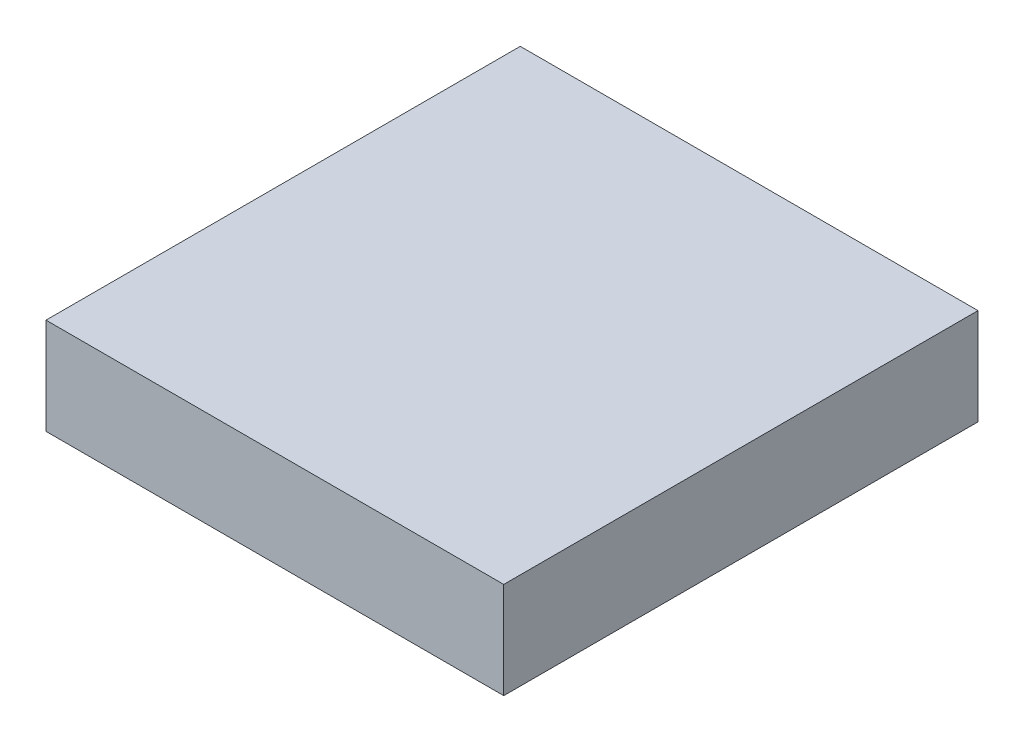
ISO-10303-21;
HEADER;
FILE_DESCRIPTION(('STEP AP214'),'2;1');
FILE_NAME('part.step','',(''),(''),'','','');
FILE_SCHEMA(('AUTOMOTIVE_DESIGN { 1 0 10303 214 1 1 1 1 }'));
ENDSEC;
DATA;
#1=APPLICATION_CONTEXT('core data for automotive mechanical design processes');
#2=APPLICATION_PROTOCOL_DEFINITION('international standard','automotive_design',2000,#1);
#3=PRODUCT_CONTEXT('',#1,'mechanical');
#4=PRODUCT('Part','Part','',(#3));
#5=PRODUCT_RELATED_PRODUCT_CATEGORY('part','',(#4));
#6=PRODUCT_DEFINITION_FORMATION('','',#4);
#7=PRODUCT_DEFINITION_CONTEXT('part definition',#1,'design');
#8=PRODUCT_DEFINITION('design','',#6,#7);
#9=PRODUCT_DEFINITION_SHAPE('','',#8);
#10=(LENGTH_UNIT() NAMED_UNIT(*) SI_UNIT(.MILLI.,.METRE.));
#11=(NAMED_UNIT(*) PLANE_ANGLE_UNIT() SI_UNIT($,.RADIAN.));
#12=(NAMED_UNIT(*) SI_UNIT($,.STERADIAN.) SOLID_ANGLE_UNIT());
#13=UNCERTAINTY_MEASURE_WITH_UNIT(LENGTH_MEASURE(1.E-05),#10,'distance_accuracy_value','');
#14=(GEOMETRIC_REPRESENTATION_CONTEXT(3) GLOBAL_UNCERTAINTY_ASSIGNED_CONTEXT((#13)) GLOBAL_UNIT_ASSIGNED_CONTEXT((#10,
#11,#12)) REPRESENTATION_CONTEXT('',''));
#15=CARTESIAN_POINT('',(0.,0.,0.));
#16=DIRECTION('',(0.,0.,1.));
#17=DIRECTION('',(1.,0.,0.));
#18=AXIS2_PLACEMENT_3D('',#15,#16,#17);
#19=CARTESIAN_POINT('',(-0.4826,-0.1016,1.));
#20=DIRECTION('',(1.,0.,0.));
#21=DIRECTION('',(0.,0.,-1.));
#22=AXIS2_PLACEMENT_3D('',#19,#20,#21);
#23=PLANE('',#22);
#24=DIRECTION('',(0.,-1.,0.));
#25=VECTOR('',#24,1.);
#26=CARTESIAN_POINT('',(-0.4826,-0.1016,0.));
#27=LINE('',#26,#25);
#28=CARTESIAN_POINT('',(-0.4826,0.1016,0.));
#29=VERTEX_POINT('',#28);
#30=CARTESIAN_POINT('',(-0.4826,-0.1016,0.));
#31=VERTEX_POINT('',#30);
#32=EDGE_CURVE('E95',#29,#31,#27,.T.);
#33=ORIENTED_EDGE('',*,*,#32,.T.);
#34=DIRECTION('',(0.,0.,-1.));
#35=VECTOR('',#34,1.);
#36=CARTESIAN_POINT('',(-0.4826,-0.1016,1.));
#37=LINE('',#36,#35);
#38=CARTESIAN_POINT('',(-0.4826,-0.1016,1.));
#39=VERTEX_POINT('',#38);
#40=EDGE_CURVE('E11',#39,#31,#37,.T.);
#41=ORIENTED_EDGE('',*,*,#40,.F.);
#42=DIRECTION('',(0.,-1.,0.));
#43=VECTOR('',#42,1.);
#44=CARTESIAN_POINT('',(-0.4826,-0.1016,1.));
#45=LINE('',#44,#43);
#46=CARTESIAN_POINT('',(-0.4826,0.1016,1.));
#47=VERTEX_POINT('',#46);
#48=EDGE_CURVE('E83',#47,#39,#45,.T.);
#49=ORIENTED_EDGE('',*,*,#48,.F.);
#50=DIRECTION('',(0.,0.,-1.));
#51=VECTOR('',#50,1.);
#52=CARTESIAN_POINT('',(-0.4826,0.1016,1.));
#53=LINE('',#52,#51);
#54=EDGE_CURVE('E91',#47,#29,#53,.T.);
#55=ORIENTED_EDGE('',*,*,#54,.T.);
#56=EDGE_LOOP('',(#33,#41,#49,#55));
#57=FACE_BOUND('',#56,.T.);
#58=ADVANCED_FACE('F32',(#57),#23,.F.);
#59=CARTESIAN_POINT('',(0.4826,-0.1016,1.));
#60=DIRECTION('',(0.,1.,0.));
#61=DIRECTION('',(0.,0.,1.));
#62=AXIS2_PLACEMENT_3D('',#59,#60,#61);
#63=PLANE('',#62);
#64=DIRECTION('',(1.,0.,0.));
#65=VECTOR('',#64,1.);
#66=CARTESIAN_POINT('',(0.4826,-0.1016,0.));
#67=LINE('',#66,#65);
#68=CARTESIAN_POINT('',(0.4826,-0.1016,0.));
#69=VERTEX_POINT('',#68);
#70=EDGE_CURVE('E87',#31,#69,#67,.T.);
#71=ORIENTED_EDGE('',*,*,#70,.T.);
#72=DIRECTION('',(0.,0.,-1.));
#73=VECTOR('',#72,1.);
#74=CARTESIAN_POINT('',(0.4826,-0.1016,1.));
#75=LINE('',#74,#73);
#76=CARTESIAN_POINT('',(0.4826,-0.1016,1.));
#77=VERTEX_POINT('',#76);
#78=EDGE_CURVE('E40',#77,#69,#75,.T.);
#79=ORIENTED_EDGE('',*,*,#78,.F.);
#80=DIRECTION('',(1.,0.,0.));
#81=VECTOR('',#80,1.);
#82=CARTESIAN_POINT('',(0.4826,-0.1016,1.));
#83=LINE('',#82,#81);
#84=EDGE_CURVE('E78',#39,#77,#83,.T.);
#85=ORIENTED_EDGE('',*,*,#84,.F.);
#86=ORIENTED_EDGE('',*,*,#40,.T.);
#87=EDGE_LOOP('',(#71,#79,#85,#86));
#88=FACE_BOUND('',#87,.T.);
#89=ADVANCED_FACE('F86',(#88),#63,.F.);
#90=CARTESIAN_POINT('',(0.4826,0.1016,1.));
#91=DIRECTION('',(-1.,0.,0.));
#92=DIRECTION('',(0.,0.,1.));
#93=AXIS2_PLACEMENT_3D('',#90,#91,#92);
#94=PLANE('',#93);
#95=DIRECTION('',(0.,1.,0.));
#96=VECTOR('',#95,1.);
#97=CARTESIAN_POINT('',(0.4826,0.1016,0.));
#98=LINE('',#97,#96);
#99=CARTESIAN_POINT('',(0.4826,0.1016,0.));
#100=VERTEX_POINT('',#99);
#101=EDGE_CURVE('E65',#69,#100,#98,.T.);
#102=ORIENTED_EDGE('',*,*,#101,.T.);
#103=DIRECTION('',(0.,0.,-1.));
#104=VECTOR('',#103,1.);
#105=CARTESIAN_POINT('',(0.4826,0.1016,1.));
#106=LINE('',#105,#104);
#107=CARTESIAN_POINT('',(0.4826,0.1016,1.));
#108=VERTEX_POINT('',#107);
#109=EDGE_CURVE('E88',#108,#100,#106,.T.);
#110=ORIENTED_EDGE('',*,*,#109,.F.);
#111=DIRECTION('',(0.,1.,0.));
#112=VECTOR('',#111,1.);
#113=CARTESIAN_POINT('',(0.4826,0.1016,1.));
#114=LINE('',#113,#112);
#115=EDGE_CURVE('E81',#77,#108,#114,.T.);
#116=ORIENTED_EDGE('',*,*,#115,.F.);
#117=ORIENTED_EDGE('',*,*,#78,.T.);
#118=EDGE_LOOP('',(#102,#110,#116,#117));
#119=FACE_BOUND('',#118,.T.);
#120=ADVANCED_FACE('F89',(#119),#94,.F.);
#121=CARTESIAN_POINT('',(-0.4826,0.1016,1.));
#122=DIRECTION('',(0.,-1.,0.));
#123=DIRECTION('',(0.,0.,-1.));
#124=AXIS2_PLACEMENT_3D('',#121,#122,#123);
#125=PLANE('',#124);
#126=DIRECTION('',(-1.,0.,0.));
#127=VECTOR('',#126,1.);
#128=CARTESIAN_POINT('',(-0.4826,0.1016,0.));
#129=LINE('',#128,#127);
#130=EDGE_CURVE('E71',#100,#29,#129,.T.);
#131=ORIENTED_EDGE('',*,*,#130,.T.);
#132=ORIENTED_EDGE('',*,*,#54,.F.);
#133=DIRECTION('',(-1.,0.,0.));
#134=VECTOR('',#133,1.);
#135=CARTESIAN_POINT('',(-0.4826,0.1016,1.));
#136=LINE('',#135,#134);
#137=EDGE_CURVE('E48',#108,#47,#136,.T.);
#138=ORIENTED_EDGE('',*,*,#137,.F.);
#139=ORIENTED_EDGE('',*,*,#109,.T.);
#140=EDGE_LOOP('',(#131,#132,#138,#139));
#141=FACE_BOUND('',#140,.T.);
#142=ADVANCED_FACE('F102',(#141),#125,.F.);
#143=CARTESIAN_POINT('',(0.,0.,1.));
#144=DIRECTION('',(0.,0.,-1.));
#145=DIRECTION('',(-1.,0.,0.));
#146=AXIS2_PLACEMENT_3D('',#143,#144,#145);
#147=PLANE('',#146);
#148=ORIENTED_EDGE('',*,*,#48,.T.);
#149=ORIENTED_EDGE('',*,*,#84,.T.);
#150=ORIENTED_EDGE('',*,*,#115,.T.);
#151=ORIENTED_EDGE('',*,*,#137,.T.);
#152=EDGE_LOOP('',(#148,#149,#150,#151));
#153=FACE_BOUND('',#152,.T.);
#154=ADVANCED_FACE('F79',(#153),#147,.F.);
#155=CARTESIAN_POINT('',(0.,0.,0.));
#156=DIRECTION('',(0.,0.,-1.));
#157=DIRECTION('',(-1.,0.,0.));
#158=AXIS2_PLACEMENT_3D('',#155,#156,#157);
#159=PLANE('',#158);
#160=ORIENTED_EDGE('',*,*,#32,.F.);
#161=ORIENTED_EDGE('',*,*,#130,.F.);
#162=ORIENTED_EDGE('',*,*,#101,.F.);
#163=ORIENTED_EDGE('',*,*,#70,.F.);
#164=EDGE_LOOP('',(#160,#161,#162,#163));
#165=FACE_BOUND('',#164,.T.);
#166=ADVANCED_FACE('F105',(#165),#159,.T.);
#167=CLOSED_SHELL('',(#58,#89,#120,#142,#154,#166));
#168=MANIFOLD_SOLID_BREP('B2',#167);
#169=ADVANCED_BREP_SHAPE_REPRESENTATION('',(#18,#168),#14);
#170=SHAPE_DEFINITION_REPRESENTATION(#9,#169);
ENDSEC;
END-ISO-10303-21;
